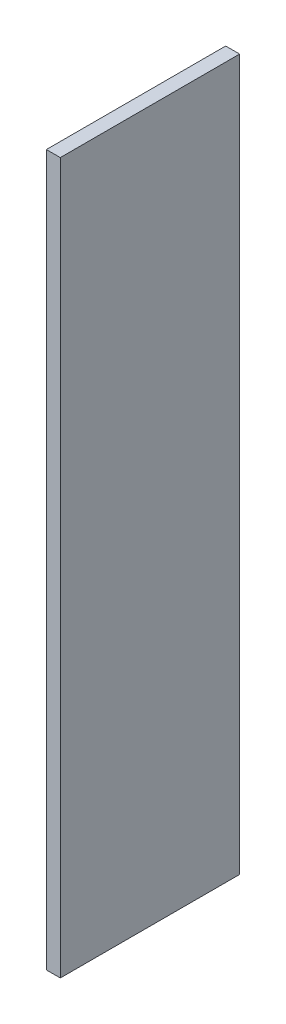
ISO-10303-21;
HEADER;
FILE_DESCRIPTION(('STEP AP214'),'2;1');
FILE_NAME('part.step','',(''),(''),'','','');
FILE_SCHEMA(('AUTOMOTIVE_DESIGN { 1 0 10303 214 1 1 1 1 }'));
ENDSEC;
DATA;
#1=APPLICATION_CONTEXT('core data for automotive mechanical design processes');
#2=APPLICATION_PROTOCOL_DEFINITION('international standard','automotive_design',2000,#1);
#3=PRODUCT_CONTEXT('',#1,'mechanical');
#4=PRODUCT('Part','Part','',(#3));
#5=PRODUCT_RELATED_PRODUCT_CATEGORY('part','',(#4));
#6=PRODUCT_DEFINITION_FORMATION('','',#4);
#7=PRODUCT_DEFINITION_CONTEXT('part definition',#1,'design');
#8=PRODUCT_DEFINITION('design','',#6,#7);
#9=PRODUCT_DEFINITION_SHAPE('','',#8);
#10=(LENGTH_UNIT() NAMED_UNIT(*) SI_UNIT(.MILLI.,.METRE.));
#11=(NAMED_UNIT(*) PLANE_ANGLE_UNIT() SI_UNIT($,.RADIAN.));
#12=(NAMED_UNIT(*) SI_UNIT($,.STERADIAN.) SOLID_ANGLE_UNIT());
#13=UNCERTAINTY_MEASURE_WITH_UNIT(LENGTH_MEASURE(1.E-05),#10,'distance_accuracy_value','');
#14=(GEOMETRIC_REPRESENTATION_CONTEXT(3) GLOBAL_UNCERTAINTY_ASSIGNED_CONTEXT((#13)) GLOBAL_UNIT_ASSIGNED_CONTEXT((#10,
#11,#12)) REPRESENTATION_CONTEXT('',''));
#15=CARTESIAN_POINT('',(0.,0.,0.));
#16=DIRECTION('',(0.,0.,1.));
#17=DIRECTION('',(1.,0.,0.));
#18=AXIS2_PLACEMENT_3D('',#15,#16,#17);
#19=CARTESIAN_POINT('',(1.5875,165.1,-19.05));
#20=DIRECTION('',(1.,0.,0.));
#21=DIRECTION('',(0.,0.,-1.));
#22=AXIS2_PLACEMENT_3D('',#19,#20,#21);
#23=PLANE('',#22);
#24=DIRECTION('',(0.,0.,1.));
#25=VECTOR('',#24,1.);
#26=CARTESIAN_POINT('',(1.5875,0.,-19.05));
#27=LINE('',#26,#25);
#28=CARTESIAN_POINT('',(1.5875,0.,-20.4343));
#29=VERTEX_POINT('',#28);
#30=CARTESIAN_POINT('',(1.5875,0.,20.4343));
#31=VERTEX_POINT('',#30);
#32=EDGE_CURVE('E81',#29,#31,#27,.T.);
#33=ORIENTED_EDGE('',*,*,#32,.F.);
#34=DIRECTION('',(0.,-1.,0.));
#35=VECTOR('',#34,1.);
#36=CARTESIAN_POINT('',(1.5875,165.1,-20.4343));
#37=LINE('',#36,#35);
#38=CARTESIAN_POINT('',(1.5875,161.925,-20.4343));
#39=VERTEX_POINT('',#38);
#40=EDGE_CURVE('E35',#39,#29,#37,.T.);
#41=ORIENTED_EDGE('',*,*,#40,.F.);
#42=DIRECTION('',(0.,0.,1.));
#43=VECTOR('',#42,1.);
#44=CARTESIAN_POINT('',(1.5875,161.925,-19.05));
#45=LINE('',#44,#43);
#46=CARTESIAN_POINT('',(1.5875,161.925,20.4343));
#47=VERTEX_POINT('',#46);
#48=EDGE_CURVE('E72',#39,#47,#45,.T.);
#49=ORIENTED_EDGE('',*,*,#48,.T.);
#50=DIRECTION('',(0.,-1.,0.));
#51=VECTOR('',#50,1.);
#52=CARTESIAN_POINT('',(1.5875,165.1,20.4343));
#53=LINE('',#52,#51);
#54=EDGE_CURVE('E10',#47,#31,#53,.T.);
#55=ORIENTED_EDGE('',*,*,#54,.T.);
#56=EDGE_LOOP('',(#33,#41,#49,#55));
#57=FACE_BOUND('',#56,.T.);
#58=ADVANCED_FACE('F16',(#57),#23,.T.);
#59=CARTESIAN_POINT('',(1.5875,165.1,20.4343));
#60=DIRECTION('',(0.,0.,1.));
#61=DIRECTION('',(1.,0.,0.));
#62=AXIS2_PLACEMENT_3D('',#59,#60,#61);
#63=PLANE('',#62);
#64=DIRECTION('',(-1.,0.,0.));
#65=VECTOR('',#64,1.);
#66=CARTESIAN_POINT('',(1.5875,0.,20.4343));
#67=LINE('',#66,#65);
#68=CARTESIAN_POINT('',(-1.5875,0.,20.4343));
#69=VERTEX_POINT('',#68);
#70=EDGE_CURVE('E75',#31,#69,#67,.T.);
#71=ORIENTED_EDGE('',*,*,#70,.F.);
#72=ORIENTED_EDGE('',*,*,#54,.F.);
#73=DIRECTION('',(-1.,0.,0.));
#74=VECTOR('',#73,1.);
#75=CARTESIAN_POINT('',(1.5875,161.925,20.4343));
#76=LINE('',#75,#74);
#77=CARTESIAN_POINT('',(-1.5875,161.925,20.4343));
#78=VERTEX_POINT('',#77);
#79=EDGE_CURVE('E87',#47,#78,#76,.T.);
#80=ORIENTED_EDGE('',*,*,#79,.T.);
#81=DIRECTION('',(0.,-1.,0.));
#82=VECTOR('',#81,1.);
#83=CARTESIAN_POINT('',(-1.5875,165.1,20.4343));
#84=LINE('',#83,#82);
#85=EDGE_CURVE('E26',#78,#69,#84,.T.);
#86=ORIENTED_EDGE('',*,*,#85,.T.);
#87=EDGE_LOOP('',(#71,#72,#80,#86));
#88=FACE_BOUND('',#87,.T.);
#89=ADVANCED_FACE('F96',(#88),#63,.T.);
#90=CARTESIAN_POINT('',(-1.5875,165.1,19.05));
#91=DIRECTION('',(-1.,0.,0.));
#92=DIRECTION('',(0.,0.,1.));
#93=AXIS2_PLACEMENT_3D('',#90,#91,#92);
#94=PLANE('',#93);
#95=DIRECTION('',(0.,0.,-1.));
#96=VECTOR('',#95,1.);
#97=CARTESIAN_POINT('',(-1.5875,0.,19.05));
#98=LINE('',#97,#96);
#99=CARTESIAN_POINT('',(-1.5875,0.,-20.4343));
#100=VERTEX_POINT('',#99);
#101=EDGE_CURVE('E61',#69,#100,#98,.T.);
#102=ORIENTED_EDGE('',*,*,#101,.F.);
#103=ORIENTED_EDGE('',*,*,#85,.F.);
#104=DIRECTION('',(0.,0.,-1.));
#105=VECTOR('',#104,1.);
#106=CARTESIAN_POINT('',(-1.5875,161.925,19.05));
#107=LINE('',#106,#105);
#108=CARTESIAN_POINT('',(-1.5875,161.925,-20.4343));
#109=VERTEX_POINT('',#108);
#110=EDGE_CURVE('E64',#78,#109,#107,.T.);
#111=ORIENTED_EDGE('',*,*,#110,.T.);
#112=DIRECTION('',(0.,-1.,0.));
#113=VECTOR('',#112,1.);
#114=CARTESIAN_POINT('',(-1.5875,165.1,-20.4343));
#115=LINE('',#114,#113);
#116=EDGE_CURVE('E20',#109,#100,#115,.T.);
#117=ORIENTED_EDGE('',*,*,#116,.T.);
#118=EDGE_LOOP('',(#102,#103,#111,#117));
#119=FACE_BOUND('',#118,.T.);
#120=ADVANCED_FACE('F59',(#119),#94,.T.);
#121=CARTESIAN_POINT('',(-1.5875,165.1,-20.4343));
#122=DIRECTION('',(0.,0.,-1.));
#123=DIRECTION('',(-1.,0.,0.));
#124=AXIS2_PLACEMENT_3D('',#121,#122,#123);
#125=PLANE('',#124);
#126=DIRECTION('',(1.,0.,0.));
#127=VECTOR('',#126,1.);
#128=CARTESIAN_POINT('',(-1.5875,0.,-20.4343));
#129=LINE('',#128,#127);
#130=EDGE_CURVE('E68',#100,#29,#129,.T.);
#131=ORIENTED_EDGE('',*,*,#130,.F.);
#132=ORIENTED_EDGE('',*,*,#116,.F.);
#133=DIRECTION('',(1.,0.,0.));
#134=VECTOR('',#133,1.);
#135=CARTESIAN_POINT('',(-1.5875,161.925,-20.4343));
#136=LINE('',#135,#134);
#137=EDGE_CURVE('E88',#109,#39,#136,.T.);
#138=ORIENTED_EDGE('',*,*,#137,.T.);
#139=ORIENTED_EDGE('',*,*,#40,.T.);
#140=EDGE_LOOP('',(#131,#132,#138,#139));
#141=FACE_BOUND('',#140,.T.);
#142=ADVANCED_FACE('F18',(#141),#125,.T.);
#143=CARTESIAN_POINT('',(0.,161.925,0.));
#144=DIRECTION('',(0.,-1.,0.));
#145=DIRECTION('',(0.,0.,-1.));
#146=AXIS2_PLACEMENT_3D('',#143,#144,#145);
#147=PLANE('',#146);
#148=ORIENTED_EDGE('',*,*,#48,.F.);
#149=ORIENTED_EDGE('',*,*,#137,.F.);
#150=ORIENTED_EDGE('',*,*,#110,.F.);
#151=ORIENTED_EDGE('',*,*,#79,.F.);
#152=EDGE_LOOP('',(#148,#149,#150,#151));
#153=FACE_BOUND('',#152,.T.);
#154=ADVANCED_FACE('F95',(#153),#147,.F.);
#155=CARTESIAN_POINT('',(0.,0.,0.));
#156=DIRECTION('',(0.,-1.,0.));
#157=DIRECTION('',(0.,0.,-1.));
#158=AXIS2_PLACEMENT_3D('',#155,#156,#157);
#159=PLANE('',#158);
#160=ORIENTED_EDGE('',*,*,#32,.T.);
#161=ORIENTED_EDGE('',*,*,#70,.T.);
#162=ORIENTED_EDGE('',*,*,#101,.T.);
#163=ORIENTED_EDGE('',*,*,#130,.T.);
#164=EDGE_LOOP('',(#160,#161,#162,#163));
#165=FACE_BOUND('',#164,.T.);
#166=ADVANCED_FACE('F74',(#165),#159,.T.);
#167=CLOSED_SHELL('',(#58,#89,#120,#142,#154,#166));
#168=MANIFOLD_SOLID_BREP('B1',#167);
#169=ADVANCED_BREP_SHAPE_REPRESENTATION('',(#18,#168),#14);
#170=SHAPE_DEFINITION_REPRESENTATION(#9,#169);
ENDSEC;
END-ISO-10303-21;
